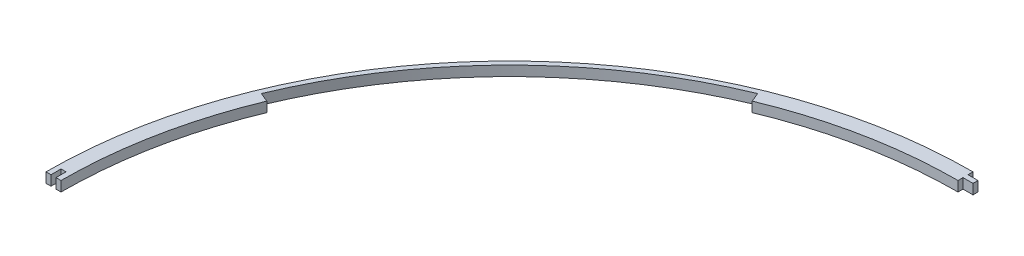
ISO-10303-21;
HEADER;
FILE_DESCRIPTION(('STEP AP214'),'2;1');
FILE_NAME('part.step','',(''),(''),'','','');
FILE_SCHEMA(('AUTOMOTIVE_DESIGN { 1 0 10303 214 1 1 1 1 }'));
ENDSEC;
DATA;
#1=APPLICATION_CONTEXT('core data for automotive mechanical design processes');
#2=APPLICATION_PROTOCOL_DEFINITION('international standard','automotive_design',2000,#1);
#3=PRODUCT_CONTEXT('',#1,'mechanical');
#4=PRODUCT('Part','Part','',(#3));
#5=PRODUCT_RELATED_PRODUCT_CATEGORY('part','',(#4));
#6=PRODUCT_DEFINITION_FORMATION('','',#4);
#7=PRODUCT_DEFINITION_CONTEXT('part definition',#1,'design');
#8=PRODUCT_DEFINITION('design','',#6,#7);
#9=PRODUCT_DEFINITION_SHAPE('','',#8);
#10=(LENGTH_UNIT() NAMED_UNIT(*) SI_UNIT(.MILLI.,.METRE.));
#11=(NAMED_UNIT(*) PLANE_ANGLE_UNIT() SI_UNIT($,.RADIAN.));
#12=(NAMED_UNIT(*) SI_UNIT($,.STERADIAN.) SOLID_ANGLE_UNIT());
#13=UNCERTAINTY_MEASURE_WITH_UNIT(LENGTH_MEASURE(1.E-05),#10,'distance_accuracy_value','');
#14=(GEOMETRIC_REPRESENTATION_CONTEXT(3) GLOBAL_UNCERTAINTY_ASSIGNED_CONTEXT((#13)) GLOBAL_UNIT_ASSIGNED_CONTEXT((#10,
#11,#12)) REPRESENTATION_CONTEXT('',''));
#15=CARTESIAN_POINT('',(0.,0.,0.));
#16=DIRECTION('',(0.,0.,1.));
#17=DIRECTION('',(1.,0.,0.));
#18=AXIS2_PLACEMENT_3D('',#15,#16,#17);
#19=CARTESIAN_POINT('',(0.,6.35,0.));
#20=DIRECTION('',(0.,-1.,0.));
#21=DIRECTION('',(0.,0.,-1.));
#22=AXIS2_PLACEMENT_3D('',#19,#20,#21);
#23=CYLINDRICAL_SURFACE('',#22,284.861);
#24=CARTESIAN_POINT('',(0.,0.,0.));
#25=DIRECTION('',(0.,1.,0.));
#26=DIRECTION('',(0.,0.,1.));
#27=AXIS2_PLACEMENT_3D('',#24,#25,#26);
#28=CIRCLE('',#27,284.861);
#29=CARTESIAN_POINT('',(0.,0.,-284.861));
#30=VERTEX_POINT('',#29);
#31=CARTESIAN_POINT('',(-109.011585226952,0.,-263.177247510698));
#32=VERTEX_POINT('',#31);
#33=EDGE_CURVE('E176',#30,#32,#28,.T.);
#34=ORIENTED_EDGE('',*,*,#33,.F.);
#35=DIRECTION('',(0.,-1.,0.));
#36=VECTOR('',#35,1.);
#37=CARTESIAN_POINT('',(0.,6.35,-284.861));
#38=LINE('',#37,#36);
#39=CARTESIAN_POINT('',(0.,6.35,-284.861));
#40=VERTEX_POINT('',#39);
#41=EDGE_CURVE('E11',#40,#30,#38,.T.);
#42=ORIENTED_EDGE('',*,*,#41,.F.);
#43=CARTESIAN_POINT('',(0.,6.35,0.));
#44=DIRECTION('',(0.,1.,0.));
#45=DIRECTION('',(0.,0.,1.));
#46=AXIS2_PLACEMENT_3D('',#43,#44,#45);
#47=CIRCLE('',#46,284.861);
#48=CARTESIAN_POINT('',(-109.011585226952,6.35,-263.177247510698));
#49=VERTEX_POINT('',#48);
#50=EDGE_CURVE('E213',#40,#49,#47,.T.);
#51=ORIENTED_EDGE('',*,*,#50,.T.);
#52=DIRECTION('',(0.,-1.,0.));
#53=VECTOR('',#52,1.);
#54=CARTESIAN_POINT('',(-109.011585226952,6.35,-263.177247510698));
#55=LINE('',#54,#53);
#56=EDGE_CURVE('E50',#49,#32,#55,.T.);
#57=ORIENTED_EDGE('',*,*,#56,.T.);
#58=EDGE_LOOP('',(#34,#42,#51,#57));
#59=FACE_BOUND('',#58,.T.);
#60=ADVANCED_FACE('F34',(#59),#23,.F.);
#61=CARTESIAN_POINT('',(0.,6.35,0.));
#62=DIRECTION('',(-1.,0.,0.));
#63=DIRECTION('',(0.,0.,1.));
#64=AXIS2_PLACEMENT_3D('',#61,#62,#63);
#65=PLANE('',#64);
#66=DIRECTION('',(0.,0.,-1.));
#67=VECTOR('',#66,1.);
#68=CARTESIAN_POINT('',(0.,0.,0.));
#69=LINE('',#68,#67);
#70=CARTESIAN_POINT('',(0.,0.,-288.036));
#71=VERTEX_POINT('',#70);
#72=EDGE_CURVE('E178',#30,#71,#69,.T.);
#73=ORIENTED_EDGE('',*,*,#72,.T.);
#74=DIRECTION('',(0.,-1.,0.));
#75=VECTOR('',#74,1.);
#76=CARTESIAN_POINT('',(0.,6.35,-288.036));
#77=LINE('',#76,#75);
#78=CARTESIAN_POINT('',(0.,6.35,-288.036));
#79=VERTEX_POINT('',#78);
#80=EDGE_CURVE('E42',#79,#71,#77,.T.);
#81=ORIENTED_EDGE('',*,*,#80,.F.);
#82=DIRECTION('',(0.,0.,-1.));
#83=VECTOR('',#82,1.);
#84=CARTESIAN_POINT('',(0.,6.35,0.));
#85=LINE('',#84,#83);
#86=EDGE_CURVE('E476',#40,#79,#85,.T.);
#87=ORIENTED_EDGE('',*,*,#86,.F.);
#88=ORIENTED_EDGE('',*,*,#41,.T.);
#89=EDGE_LOOP('',(#73,#81,#87,#88));
#90=FACE_BOUND('',#89,.T.);
#91=ADVANCED_FACE('F302',(#90),#65,.F.);
#92=CARTESIAN_POINT('',(0.,6.35,-288.036));
#93=DIRECTION('',(0.,0.,-1.));
#94=DIRECTION('',(-1.,0.,0.));
#95=AXIS2_PLACEMENT_3D('',#92,#93,#94);
#96=PLANE('',#95);
#97=DIRECTION('',(1.,0.,0.));
#98=VECTOR('',#97,1.);
#99=CARTESIAN_POINT('',(0.,0.,-288.036));
#100=LINE('',#99,#98);
#101=CARTESIAN_POINT('',(6.35,0.,-288.036));
#102=VERTEX_POINT('',#101);
#103=EDGE_CURVE('E180',#71,#102,#100,.T.);
#104=ORIENTED_EDGE('',*,*,#103,.T.);
#105=DIRECTION('',(0.,-1.,0.));
#106=VECTOR('',#105,1.);
#107=CARTESIAN_POINT('',(6.35,6.35,-288.036));
#108=LINE('',#107,#106);
#109=CARTESIAN_POINT('',(6.35,6.35,-288.036));
#110=VERTEX_POINT('',#109);
#111=EDGE_CURVE('E240',#110,#102,#108,.T.);
#112=ORIENTED_EDGE('',*,*,#111,.F.);
#113=DIRECTION('',(1.,0.,0.));
#114=VECTOR('',#113,1.);
#115=CARTESIAN_POINT('',(0.,6.35,-288.036));
#116=LINE('',#115,#114);
#117=EDGE_CURVE('E249',#79,#110,#116,.T.);
#118=ORIENTED_EDGE('',*,*,#117,.F.);
#119=ORIENTED_EDGE('',*,*,#80,.T.);
#120=EDGE_LOOP('',(#104,#112,#118,#119));
#121=FACE_BOUND('',#120,.T.);
#122=ADVANCED_FACE('F247',(#121),#96,.F.);
#123=CARTESIAN_POINT('',(6.35,6.35,0.));
#124=DIRECTION('',(-1.,0.,0.));
#125=DIRECTION('',(0.,0.,1.));
#126=AXIS2_PLACEMENT_3D('',#123,#124,#125);
#127=PLANE('',#126);
#128=DIRECTION('',(0.,0.,-1.));
#129=VECTOR('',#128,1.);
#130=CARTESIAN_POINT('',(6.35,0.,0.));
#131=LINE('',#130,#129);
#132=CARTESIAN_POINT('',(6.35,0.,-291.211));
#133=VERTEX_POINT('',#132);
#134=EDGE_CURVE('E182',#102,#133,#131,.T.);
#135=ORIENTED_EDGE('',*,*,#134,.T.);
#136=DIRECTION('',(0.,-1.,0.));
#137=VECTOR('',#136,1.);
#138=CARTESIAN_POINT('',(6.35,6.35,-291.211));
#139=LINE('',#138,#137);
#140=CARTESIAN_POINT('',(6.35,6.35,-291.211));
#141=VERTEX_POINT('',#140);
#142=EDGE_CURVE('E237',#141,#133,#139,.T.);
#143=ORIENTED_EDGE('',*,*,#142,.F.);
#144=DIRECTION('',(0.,0.,-1.));
#145=VECTOR('',#144,1.);
#146=CARTESIAN_POINT('',(6.35,6.35,0.));
#147=LINE('',#146,#145);
#148=EDGE_CURVE('E268',#110,#141,#147,.T.);
#149=ORIENTED_EDGE('',*,*,#148,.F.);
#150=ORIENTED_EDGE('',*,*,#111,.T.);
#151=EDGE_LOOP('',(#135,#143,#149,#150));
#152=FACE_BOUND('',#151,.T.);
#153=ADVANCED_FACE('F259',(#152),#127,.F.);
#154=CARTESIAN_POINT('',(0.,6.35,-291.211));
#155=DIRECTION('',(0.,0.,1.));
#156=DIRECTION('',(1.,0.,0.));
#157=AXIS2_PLACEMENT_3D('',#154,#155,#156);
#158=PLANE('',#157);
#159=DIRECTION('',(-1.,0.,0.));
#160=VECTOR('',#159,1.);
#161=CARTESIAN_POINT('',(0.,0.,-291.211));
#162=LINE('',#161,#160);
#163=CARTESIAN_POINT('',(0.,0.,-291.211));
#164=VERTEX_POINT('',#163);
#165=EDGE_CURVE('E184',#133,#164,#162,.T.);
#166=ORIENTED_EDGE('',*,*,#165,.T.);
#167=DIRECTION('',(0.,-1.,0.));
#168=VECTOR('',#167,1.);
#169=CARTESIAN_POINT('',(0.,6.35,-291.211));
#170=LINE('',#169,#168);
#171=CARTESIAN_POINT('',(0.,6.35,-291.211));
#172=VERTEX_POINT('',#171);
#173=EDGE_CURVE('E234',#172,#164,#170,.T.);
#174=ORIENTED_EDGE('',*,*,#173,.F.);
#175=DIRECTION('',(-1.,0.,0.));
#176=VECTOR('',#175,1.);
#177=CARTESIAN_POINT('',(0.,6.35,-291.211));
#178=LINE('',#177,#176);
#179=EDGE_CURVE('E265',#141,#172,#178,.T.);
#180=ORIENTED_EDGE('',*,*,#179,.F.);
#181=ORIENTED_EDGE('',*,*,#142,.T.);
#182=EDGE_LOOP('',(#166,#174,#180,#181));
#183=FACE_BOUND('',#182,.T.);
#184=ADVANCED_FACE('F263',(#183),#158,.F.);
#185=CARTESIAN_POINT('',(0.,6.35,0.));
#186=DIRECTION('',(-1.,0.,0.));
#187=DIRECTION('',(0.,0.,1.));
#188=AXIS2_PLACEMENT_3D('',#185,#186,#187);
#189=PLANE('',#188);
#190=DIRECTION('',(0.,0.,-1.));
#191=VECTOR('',#190,1.);
#192=CARTESIAN_POINT('',(0.,0.,0.));
#193=LINE('',#192,#191);
#194=CARTESIAN_POINT('',(0.,0.,-294.386));
#195=VERTEX_POINT('',#194);
#196=EDGE_CURVE('E186',#164,#195,#193,.T.);
#197=ORIENTED_EDGE('',*,*,#196,.T.);
#198=DIRECTION('',(0.,-1.,0.));
#199=VECTOR('',#198,1.);
#200=CARTESIAN_POINT('',(0.,6.35,-294.386));
#201=LINE('',#200,#199);
#202=CARTESIAN_POINT('',(0.,6.35,-294.386));
#203=VERTEX_POINT('',#202);
#204=EDGE_CURVE('E231',#203,#195,#201,.T.);
#205=ORIENTED_EDGE('',*,*,#204,.F.);
#206=DIRECTION('',(0.,0.,-1.));
#207=VECTOR('',#206,1.);
#208=CARTESIAN_POINT('',(0.,6.35,0.));
#209=LINE('',#208,#207);
#210=EDGE_CURVE('E267',#172,#203,#209,.T.);
#211=ORIENTED_EDGE('',*,*,#210,.F.);
#212=ORIENTED_EDGE('',*,*,#173,.T.);
#213=EDGE_LOOP('',(#197,#205,#211,#212));
#214=FACE_BOUND('',#213,.T.);
#215=ADVANCED_FACE('F315',(#214),#189,.F.);
#216=CARTESIAN_POINT('',(0.,6.35,0.));
#217=DIRECTION('',(0.,-1.,0.));
#218=DIRECTION('',(0.,0.,-1.));
#219=AXIS2_PLACEMENT_3D('',#216,#217,#218);
#220=CYLINDRICAL_SURFACE('',#219,294.386);
#221=CARTESIAN_POINT('',(0.,0.,0.));
#222=DIRECTION('',(0.,1.,0.));
#223=DIRECTION('',(0.,0.,1.));
#224=AXIS2_PLACEMENT_3D('',#221,#222,#223);
#225=CIRCLE('',#224,294.386);
#226=CARTESIAN_POINT('',(-294.386,0.,0.));
#227=VERTEX_POINT('',#226);
#228=EDGE_CURVE('E188',#195,#227,#225,.T.);
#229=ORIENTED_EDGE('',*,*,#228,.T.);
#230=DIRECTION('',(0.,-1.,0.));
#231=VECTOR('',#230,1.);
#232=CARTESIAN_POINT('',(-294.386,6.35,0.));
#233=LINE('',#232,#231);
#234=CARTESIAN_POINT('',(-294.386,6.35,0.));
#235=VERTEX_POINT('',#234);
#236=EDGE_CURVE('E229',#235,#227,#233,.T.);
#237=ORIENTED_EDGE('',*,*,#236,.F.);
#238=CARTESIAN_POINT('',(0.,6.35,0.));
#239=DIRECTION('',(0.,1.,0.));
#240=DIRECTION('',(0.,0.,1.));
#241=AXIS2_PLACEMENT_3D('',#238,#239,#240);
#242=CIRCLE('',#241,294.386);
#243=EDGE_CURVE('E270',#203,#235,#242,.T.);
#244=ORIENTED_EDGE('',*,*,#243,.F.);
#245=ORIENTED_EDGE('',*,*,#204,.T.);
#246=EDGE_LOOP('',(#229,#237,#244,#245));
#247=FACE_BOUND('',#246,.T.);
#248=ADVANCED_FACE('F318',(#247),#220,.T.);
#249=CARTESIAN_POINT('',(0.,6.35,0.));
#250=DIRECTION('',(0.,0.,1.));
#251=DIRECTION('',(1.,0.,0.));
#252=AXIS2_PLACEMENT_3D('',#249,#250,#251);
#253=PLANE('',#252);
#254=DIRECTION('',(-1.,0.,0.));
#255=VECTOR('',#254,1.);
#256=CARTESIAN_POINT('',(0.,0.,0.));
#257=LINE('',#256,#255);
#258=CARTESIAN_POINT('',(-291.211,0.,0.));
#259=VERTEX_POINT('',#258);
#260=EDGE_CURVE('E191',#259,#227,#257,.T.);
#261=ORIENTED_EDGE('',*,*,#260,.F.);
#262=DIRECTION('',(0.,-1.,0.));
#263=VECTOR('',#262,1.);
#264=CARTESIAN_POINT('',(-291.211,6.35,0.));
#265=LINE('',#264,#263);
#266=CARTESIAN_POINT('',(-291.211,6.35,0.));
#267=VERTEX_POINT('',#266);
#268=EDGE_CURVE('E227',#267,#259,#265,.T.);
#269=ORIENTED_EDGE('',*,*,#268,.F.);
#270=DIRECTION('',(-1.,0.,0.));
#271=VECTOR('',#270,1.);
#272=CARTESIAN_POINT('',(0.,6.35,0.));
#273=LINE('',#272,#271);
#274=EDGE_CURVE('E276',#267,#235,#273,.T.);
#275=ORIENTED_EDGE('',*,*,#274,.T.);
#276=ORIENTED_EDGE('',*,*,#236,.T.);
#277=EDGE_LOOP('',(#261,#269,#275,#276));
#278=FACE_BOUND('',#277,.T.);
#279=ADVANCED_FACE('F322',(#278),#253,.T.);
#280=CARTESIAN_POINT('',(-291.211,6.35,0.));
#281=DIRECTION('',(-1.,0.,0.));
#282=DIRECTION('',(0.,0.,1.));
#283=AXIS2_PLACEMENT_3D('',#280,#281,#282);
#284=PLANE('',#283);
#285=DIRECTION('',(0.,0.,-1.));
#286=VECTOR('',#285,1.);
#287=CARTESIAN_POINT('',(-291.211,0.,0.));
#288=LINE('',#287,#286);
#289=CARTESIAN_POINT('',(-291.211,0.,-6.35));
#290=VERTEX_POINT('',#289);
#291=EDGE_CURVE('E194',#259,#290,#288,.T.);
#292=ORIENTED_EDGE('',*,*,#291,.T.);
#293=DIRECTION('',(0.,-1.,0.));
#294=VECTOR('',#293,1.);
#295=CARTESIAN_POINT('',(-291.211,6.35,-6.35));
#296=LINE('',#295,#294);
#297=CARTESIAN_POINT('',(-291.211,6.35,-6.35));
#298=VERTEX_POINT('',#297);
#299=EDGE_CURVE('E224',#298,#290,#296,.T.);
#300=ORIENTED_EDGE('',*,*,#299,.F.);
#301=DIRECTION('',(0.,0.,-1.));
#302=VECTOR('',#301,1.);
#303=CARTESIAN_POINT('',(-291.211,6.35,0.));
#304=LINE('',#303,#302);
#305=EDGE_CURVE('E279',#267,#298,#304,.T.);
#306=ORIENTED_EDGE('',*,*,#305,.F.);
#307=ORIENTED_EDGE('',*,*,#268,.T.);
#308=EDGE_LOOP('',(#292,#300,#306,#307));
#309=FACE_BOUND('',#308,.T.);
#310=ADVANCED_FACE('F326',(#309),#284,.F.);
#311=CARTESIAN_POINT('',(0.,6.35,-6.35));
#312=DIRECTION('',(0.,0.,-1.));
#313=DIRECTION('',(-1.,0.,0.));
#314=AXIS2_PLACEMENT_3D('',#311,#312,#313);
#315=PLANE('',#314);
#316=DIRECTION('',(1.,0.,0.));
#317=VECTOR('',#316,1.);
#318=CARTESIAN_POINT('',(0.,0.,-6.35));
#319=LINE('',#318,#317);
#320=CARTESIAN_POINT('',(-288.036,0.,-6.35));
#321=VERTEX_POINT('',#320);
#322=EDGE_CURVE('E196',#290,#321,#319,.T.);
#323=ORIENTED_EDGE('',*,*,#322,.T.);
#324=DIRECTION('',(0.,-1.,0.));
#325=VECTOR('',#324,1.);
#326=CARTESIAN_POINT('',(-288.036,6.35,-6.35));
#327=LINE('',#326,#325);
#328=CARTESIAN_POINT('',(-288.036,6.35,-6.35));
#329=VERTEX_POINT('',#328);
#330=EDGE_CURVE('E221',#329,#321,#327,.T.);
#331=ORIENTED_EDGE('',*,*,#330,.F.);
#332=DIRECTION('',(1.,0.,0.));
#333=VECTOR('',#332,1.);
#334=CARTESIAN_POINT('',(0.,6.35,-6.35));
#335=LINE('',#334,#333);
#336=EDGE_CURVE('E281',#298,#329,#335,.T.);
#337=ORIENTED_EDGE('',*,*,#336,.F.);
#338=ORIENTED_EDGE('',*,*,#299,.T.);
#339=EDGE_LOOP('',(#323,#331,#337,#338));
#340=FACE_BOUND('',#339,.T.);
#341=ADVANCED_FACE('F330',(#340),#315,.F.);
#342=CARTESIAN_POINT('',(-288.036,6.35,0.));
#343=DIRECTION('',(1.,0.,0.));
#344=DIRECTION('',(0.,0.,-1.));
#345=AXIS2_PLACEMENT_3D('',#342,#343,#344);
#346=PLANE('',#345);
#347=DIRECTION('',(0.,0.,1.));
#348=VECTOR('',#347,1.);
#349=CARTESIAN_POINT('',(-288.036,0.,0.));
#350=LINE('',#349,#348);
#351=CARTESIAN_POINT('',(-288.036,0.,0.));
#352=VERTEX_POINT('',#351);
#353=EDGE_CURVE('E198',#321,#352,#350,.T.);
#354=ORIENTED_EDGE('',*,*,#353,.T.);
#355=DIRECTION('',(0.,-1.,0.));
#356=VECTOR('',#355,1.);
#357=CARTESIAN_POINT('',(-288.036,6.35,0.));
#358=LINE('',#357,#356);
#359=CARTESIAN_POINT('',(-288.036,6.35,0.));
#360=VERTEX_POINT('',#359);
#361=EDGE_CURVE('E219',#360,#352,#358,.T.);
#362=ORIENTED_EDGE('',*,*,#361,.F.);
#363=DIRECTION('',(0.,0.,1.));
#364=VECTOR('',#363,1.);
#365=CARTESIAN_POINT('',(-288.036,6.35,0.));
#366=LINE('',#365,#364);
#367=EDGE_CURVE('E283',#329,#360,#366,.T.);
#368=ORIENTED_EDGE('',*,*,#367,.F.);
#369=ORIENTED_EDGE('',*,*,#330,.T.);
#370=EDGE_LOOP('',(#354,#362,#368,#369));
#371=FACE_BOUND('',#370,.T.);
#372=ADVANCED_FACE('F334',(#371),#346,.F.);
#373=CARTESIAN_POINT('',(0.,6.35,0.));
#374=DIRECTION('',(0.,0.,1.));
#375=DIRECTION('',(1.,0.,0.));
#376=AXIS2_PLACEMENT_3D('',#373,#374,#375);
#377=PLANE('',#376);
#378=DIRECTION('',(-1.,0.,0.));
#379=VECTOR('',#378,1.);
#380=CARTESIAN_POINT('',(0.,0.,0.));
#381=LINE('',#380,#379);
#382=CARTESIAN_POINT('',(-284.861,0.,0.));
#383=VERTEX_POINT('',#382);
#384=EDGE_CURVE('E201',#383,#352,#381,.T.);
#385=ORIENTED_EDGE('',*,*,#384,.F.);
#386=DIRECTION('',(0.,-1.,0.));
#387=VECTOR('',#386,1.);
#388=CARTESIAN_POINT('',(-284.861,6.35,0.));
#389=LINE('',#388,#387);
#390=CARTESIAN_POINT('',(-284.861,6.35,0.));
#391=VERTEX_POINT('',#390);
#392=EDGE_CURVE('E217',#391,#383,#389,.T.);
#393=ORIENTED_EDGE('',*,*,#392,.F.);
#394=DIRECTION('',(-1.,0.,0.));
#395=VECTOR('',#394,1.);
#396=CARTESIAN_POINT('',(0.,6.35,0.));
#397=LINE('',#396,#395);
#398=EDGE_CURVE('E285',#391,#360,#397,.T.);
#399=ORIENTED_EDGE('',*,*,#398,.T.);
#400=ORIENTED_EDGE('',*,*,#361,.T.);
#401=EDGE_LOOP('',(#385,#393,#399,#400));
#402=FACE_BOUND('',#401,.T.);
#403=ADVANCED_FACE('F338',(#402),#377,.T.);
#404=CARTESIAN_POINT('',(0.,6.35,0.));
#405=DIRECTION('',(0.,-1.,0.));
#406=DIRECTION('',(0.,0.,-1.));
#407=AXIS2_PLACEMENT_3D('',#404,#405,#406);
#408=CYLINDRICAL_SURFACE('',#407,284.861);
#409=CARTESIAN_POINT('',(0.,0.,0.));
#410=DIRECTION('',(0.,1.,0.));
#411=DIRECTION('',(0.,0.,1.));
#412=AXIS2_PLACEMENT_3D('',#409,#410,#411);
#413=CIRCLE('',#412,284.861);
#414=CARTESIAN_POINT('',(-263.177247510698,0.,-109.011585226952));
#415=VERTEX_POINT('',#414);
#416=EDGE_CURVE('E204',#415,#383,#413,.T.);
#417=ORIENTED_EDGE('',*,*,#416,.F.);
#418=DIRECTION('',(0.,-1.,0.));
#419=VECTOR('',#418,1.);
#420=CARTESIAN_POINT('',(-263.177247510698,6.35,-109.011585226952));
#421=LINE('',#420,#419);
#422=CARTESIAN_POINT('',(-263.177247510698,6.35,-109.011585226952));
#423=VERTEX_POINT('',#422);
#424=EDGE_CURVE('E168',#423,#415,#421,.T.);
#425=ORIENTED_EDGE('',*,*,#424,.F.);
#426=CARTESIAN_POINT('',(0.,6.35,0.));
#427=DIRECTION('',(0.,1.,0.));
#428=DIRECTION('',(0.,0.,1.));
#429=AXIS2_PLACEMENT_3D('',#426,#427,#428);
#430=CIRCLE('',#429,284.861);
#431=EDGE_CURVE('E158',#423,#391,#430,.T.);
#432=ORIENTED_EDGE('',*,*,#431,.T.);
#433=ORIENTED_EDGE('',*,*,#392,.T.);
#434=EDGE_LOOP('',(#417,#425,#432,#433));
#435=FACE_BOUND('',#434,.T.);
#436=ADVANCED_FACE('F289',(#435),#408,.F.);
#437=CARTESIAN_POINT('',(-1.43391585742079E-13,6.35,3.4617791102871E-13));
#438=DIRECTION('',(-0.382683432365092,0.,0.923879532511286));
#439=DIRECTION('',(0.923879532511286,0.,0.382683432365092));
#440=AXIS2_PLACEMENT_3D('',#437,#438,#439);
#441=PLANE('',#440);
#442=DIRECTION('',(-0.923879532511286,0.,-0.382683432365092));
#443=VECTOR('',#442,1.);
#444=CARTESIAN_POINT('',(-1.43391585742079E-13,0.,3.4617791102871E-13));
#445=LINE('',#444,#443);
#446=CARTESIAN_POINT('',(-269.043882542144,0.,-111.44162502247));
#447=VERTEX_POINT('',#446);
#448=EDGE_CURVE('E165',#415,#447,#445,.T.);
#449=ORIENTED_EDGE('',*,*,#448,.T.);
#450=DIRECTION('',(0.,-1.,0.));
#451=VECTOR('',#450,1.);
#452=CARTESIAN_POINT('',(-269.043882542144,6.35,-111.44162502247));
#453=LINE('',#452,#451);
#454=CARTESIAN_POINT('',(-269.043882542144,6.35,-111.44162502247));
#455=VERTEX_POINT('',#454);
#456=EDGE_CURVE('E162',#455,#447,#453,.T.);
#457=ORIENTED_EDGE('',*,*,#456,.F.);
#458=DIRECTION('',(-0.923879532511286,0.,-0.382683432365092));
#459=VECTOR('',#458,1.);
#460=CARTESIAN_POINT('',(-1.43391585742079E-13,6.35,3.4617791102871E-13));
#461=LINE('',#460,#459);
#462=EDGE_CURVE('E149',#423,#455,#461,.T.);
#463=ORIENTED_EDGE('',*,*,#462,.F.);
#464=ORIENTED_EDGE('',*,*,#424,.T.);
#465=EDGE_LOOP('',(#449,#457,#463,#464));
#466=FACE_BOUND('',#465,.T.);
#467=ADVANCED_FACE('F163',(#466),#441,.F.);
#468=CARTESIAN_POINT('',(0.,6.35,0.));
#469=DIRECTION('',(0.,-1.,0.));
#470=DIRECTION('',(0.,0.,-1.));
#471=AXIS2_PLACEMENT_3D('',#468,#469,#470);
#472=CYLINDRICAL_SURFACE('',#471,291.211);
#473=CARTESIAN_POINT('',(0.,0.,0.));
#474=DIRECTION('',(0.,1.,0.));
#475=DIRECTION('',(0.,0.,1.));
#476=AXIS2_PLACEMENT_3D('',#473,#474,#475);
#477=CIRCLE('',#476,291.211);
#478=CARTESIAN_POINT('',(-111.44162502247,0.,-269.043882542144));
#479=VERTEX_POINT('',#478);
#480=EDGE_CURVE('E208',#479,#447,#477,.T.);
#481=ORIENTED_EDGE('',*,*,#480,.F.);
#482=DIRECTION('',(0.,-1.,0.));
#483=VECTOR('',#482,1.);
#484=CARTESIAN_POINT('',(-111.44162502247,6.35,-269.043882542144));
#485=LINE('',#484,#483);
#486=CARTESIAN_POINT('',(-111.44162502247,6.35,-269.043882542144));
#487=VERTEX_POINT('',#486);
#488=EDGE_CURVE('E99',#487,#479,#485,.T.);
#489=ORIENTED_EDGE('',*,*,#488,.F.);
#490=CARTESIAN_POINT('',(0.,6.35,0.));
#491=DIRECTION('',(0.,1.,0.));
#492=DIRECTION('',(0.,0.,1.));
#493=AXIS2_PLACEMENT_3D('',#490,#491,#492);
#494=CIRCLE('',#493,291.211);
#495=EDGE_CURVE('E155',#487,#455,#494,.T.);
#496=ORIENTED_EDGE('',*,*,#495,.T.);
#497=ORIENTED_EDGE('',*,*,#456,.T.);
#498=EDGE_LOOP('',(#481,#489,#496,#497));
#499=FACE_BOUND('',#498,.T.);
#500=ADVANCED_FACE('F170',(#499),#472,.F.);
#501=CARTESIAN_POINT('',(-3.84642123365234E-13,6.35,1.59323984157865E-13));
#502=DIRECTION('',(-0.923879532511287,0.,0.382683432365089));
#503=DIRECTION('',(0.382683432365089,0.,0.923879532511287));
#504=AXIS2_PLACEMENT_3D('',#501,#502,#503);
#505=PLANE('',#504);
#506=DIRECTION('',(-0.382683432365089,0.,-0.923879532511287));
#507=VECTOR('',#506,1.);
#508=CARTESIAN_POINT('',(-3.84642123365234E-13,0.,1.59323984157865E-13));
#509=LINE('',#508,#507);
#510=EDGE_CURVE('E210',#32,#479,#509,.T.);
#511=ORIENTED_EDGE('',*,*,#510,.F.);
#512=ORIENTED_EDGE('',*,*,#56,.F.);
#513=DIRECTION('',(-0.382683432365089,0.,-0.923879532511287));
#514=VECTOR('',#513,1.);
#515=CARTESIAN_POINT('',(-3.84642123365234E-13,6.35,1.59323984157865E-13));
#516=LINE('',#515,#514);
#517=EDGE_CURVE('E171',#49,#487,#516,.T.);
#518=ORIENTED_EDGE('',*,*,#517,.T.);
#519=ORIENTED_EDGE('',*,*,#488,.T.);
#520=EDGE_LOOP('',(#511,#512,#518,#519));
#521=FACE_BOUND('',#520,.T.);
#522=ADVANCED_FACE('F291',(#521),#505,.T.);
#523=CARTESIAN_POINT('',(0.,6.35,0.));
#524=DIRECTION('',(0.,1.,0.));
#525=DIRECTION('',(0.,0.,1.));
#526=AXIS2_PLACEMENT_3D('',#523,#524,#525);
#527=PLANE('',#526);
#528=ORIENTED_EDGE('',*,*,#50,.F.);
#529=ORIENTED_EDGE('',*,*,#86,.T.);
#530=ORIENTED_EDGE('',*,*,#117,.T.);
#531=ORIENTED_EDGE('',*,*,#148,.T.);
#532=ORIENTED_EDGE('',*,*,#179,.T.);
#533=ORIENTED_EDGE('',*,*,#210,.T.);
#534=ORIENTED_EDGE('',*,*,#243,.T.);
#535=ORIENTED_EDGE('',*,*,#274,.F.);
#536=ORIENTED_EDGE('',*,*,#305,.T.);
#537=ORIENTED_EDGE('',*,*,#336,.T.);
#538=ORIENTED_EDGE('',*,*,#367,.T.);
#539=ORIENTED_EDGE('',*,*,#398,.F.);
#540=ORIENTED_EDGE('',*,*,#431,.F.);
#541=ORIENTED_EDGE('',*,*,#462,.T.);
#542=ORIENTED_EDGE('',*,*,#495,.F.);
#543=ORIENTED_EDGE('',*,*,#517,.F.);
#544=EDGE_LOOP('',(#528,#529,#530,#531,#532,#533,#534,#535,#536,#537,#538,#539,#540,#541,#542,#543));
#545=FACE_BOUND('',#544,.T.);
#546=ADVANCED_FACE('F152',(#545),#527,.T.);
#547=CARTESIAN_POINT('',(0.,0.,0.));
#548=DIRECTION('',(0.,1.,0.));
#549=DIRECTION('',(0.,0.,1.));
#550=AXIS2_PLACEMENT_3D('',#547,#548,#549);
#551=PLANE('',#550);
#552=ORIENTED_EDGE('',*,*,#33,.T.);
#553=ORIENTED_EDGE('',*,*,#510,.T.);
#554=ORIENTED_EDGE('',*,*,#480,.T.);
#555=ORIENTED_EDGE('',*,*,#448,.F.);
#556=ORIENTED_EDGE('',*,*,#416,.T.);
#557=ORIENTED_EDGE('',*,*,#384,.T.);
#558=ORIENTED_EDGE('',*,*,#353,.F.);
#559=ORIENTED_EDGE('',*,*,#322,.F.);
#560=ORIENTED_EDGE('',*,*,#291,.F.);
#561=ORIENTED_EDGE('',*,*,#260,.T.);
#562=ORIENTED_EDGE('',*,*,#228,.F.);
#563=ORIENTED_EDGE('',*,*,#196,.F.);
#564=ORIENTED_EDGE('',*,*,#165,.F.);
#565=ORIENTED_EDGE('',*,*,#134,.F.);
#566=ORIENTED_EDGE('',*,*,#103,.F.);
#567=ORIENTED_EDGE('',*,*,#72,.F.);
#568=EDGE_LOOP('',(#552,#553,#554,#555,#556,#557,#558,#559,#560,#561,#562,#563,#564,#565,#566,#567));
#569=FACE_BOUND('',#568,.T.);
#570=ADVANCED_FACE('F254',(#569),#551,.F.);
#571=CLOSED_SHELL('',(#60,#91,#122,#153,#184,#215,#248,#279,#310,#341,#372,#403,#436,#467,#500,
#522,#546,#570));
#572=MANIFOLD_SOLID_BREP('B2',#571);
#573=ADVANCED_BREP_SHAPE_REPRESENTATION('',(#18,#572),#14);
#574=SHAPE_DEFINITION_REPRESENTATION(#9,#573);
ENDSEC;
END-ISO-10303-21;
